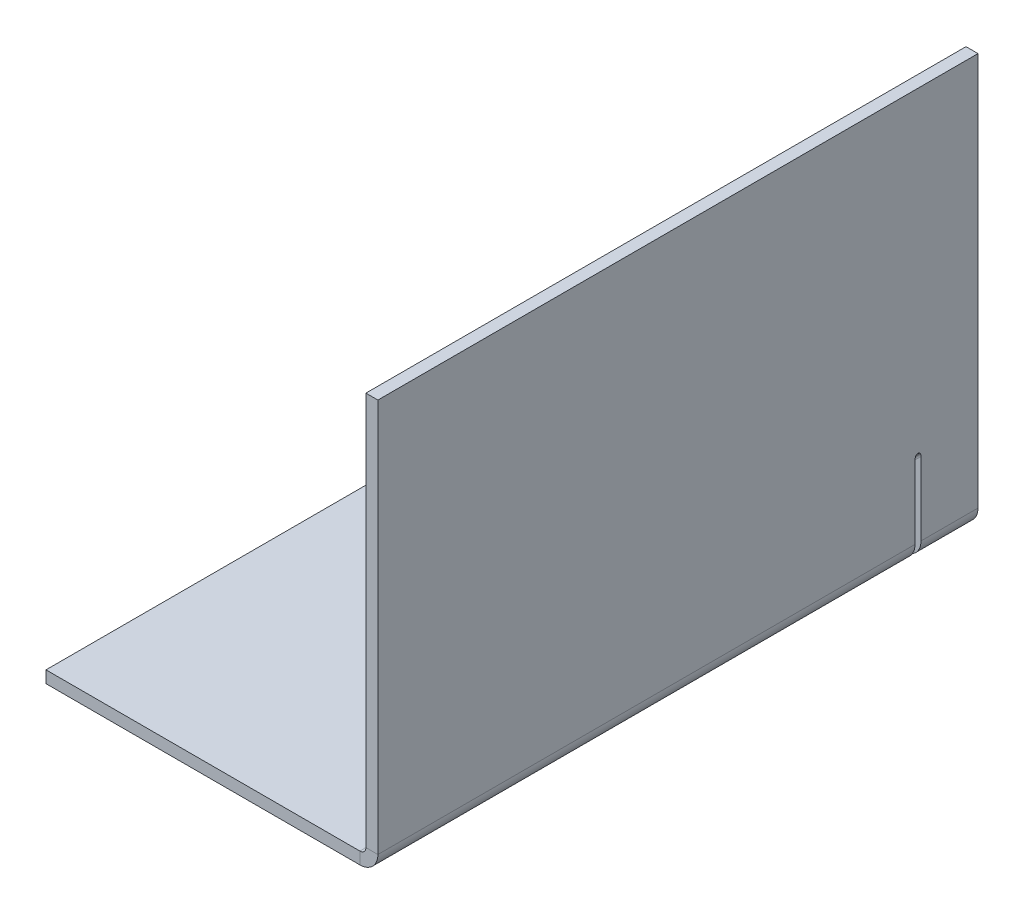
ISO-10303-21;
HEADER;
FILE_DESCRIPTION(('STEP AP214'),'2;1');
FILE_NAME('part.step','',(''),(''),'','','');
FILE_SCHEMA(('AUTOMOTIVE_DESIGN { 1 0 10303 214 1 1 1 1 }'));
ENDSEC;
DATA;
#1=APPLICATION_CONTEXT('core data for automotive mechanical design processes');
#2=APPLICATION_PROTOCOL_DEFINITION('international standard','automotive_design',2000,#1);
#3=PRODUCT_CONTEXT('',#1,'mechanical');
#4=PRODUCT('Part','Part','',(#3));
#5=PRODUCT_RELATED_PRODUCT_CATEGORY('part','',(#4));
#6=PRODUCT_DEFINITION_FORMATION('','',#4);
#7=PRODUCT_DEFINITION_CONTEXT('part definition',#1,'design');
#8=PRODUCT_DEFINITION('design','',#6,#7);
#9=PRODUCT_DEFINITION_SHAPE('','',#8);
#10=(LENGTH_UNIT() NAMED_UNIT(*) SI_UNIT(.MILLI.,.METRE.));
#11=(NAMED_UNIT(*) PLANE_ANGLE_UNIT() SI_UNIT($,.RADIAN.));
#12=(NAMED_UNIT(*) SI_UNIT($,.STERADIAN.) SOLID_ANGLE_UNIT());
#13=UNCERTAINTY_MEASURE_WITH_UNIT(LENGTH_MEASURE(1.E-05),#10,'distance_accuracy_value','');
#14=(GEOMETRIC_REPRESENTATION_CONTEXT(3) GLOBAL_UNCERTAINTY_ASSIGNED_CONTEXT((#13)) GLOBAL_UNIT_ASSIGNED_CONTEXT((#10,
#11,#12)) REPRESENTATION_CONTEXT('',''));
#15=CARTESIAN_POINT('',(0.,0.,0.));
#16=DIRECTION('',(0.,0.,1.));
#17=DIRECTION('',(1.,0.,0.));
#18=AXIS2_PLACEMENT_3D('',#15,#16,#17);
#19=CARTESIAN_POINT('',(-53.3038384150787,-2.,0.));
#20=DIRECTION('',(0.,-1.,0.));
#21=DIRECTION('',(0.,0.,-1.));
#22=AXIS2_PLACEMENT_3D('',#19,#20,#21);
#23=PLANE('',#22);
#24=DIRECTION('',(0.,0.,-1.));
#25=VECTOR('',#24,1.);
#26=CARTESIAN_POINT('',(-1.,-2.,0.));
#27=LINE('',#26,#25);
#28=CARTESIAN_POINT('',(-1.,-2.,9.5));
#29=VERTEX_POINT('',#28);
#30=CARTESIAN_POINT('',(-1.,-2.,0.));
#31=VERTEX_POINT('',#30);
#32=EDGE_CURVE('E246',#29,#31,#27,.T.);
#33=ORIENTED_EDGE('',*,*,#32,.F.);
#34=DIRECTION('',(-1.,0.,0.));
#35=VECTOR('',#34,1.);
#36=CARTESIAN_POINT('',(-53.3038384150787,-2.,9.5));
#37=LINE('',#36,#35);
#38=CARTESIAN_POINT('',(-13.1923881554251,-2.,9.5));
#39=VERTEX_POINT('',#38);
#40=EDGE_CURVE('E181',#29,#39,#37,.T.);
#41=ORIENTED_EDGE('',*,*,#40,.T.);
#42=CARTESIAN_POINT('',(-13.1923881554251,-2.,10.));
#43=DIRECTION('',(0.,-1.,0.));
#44=DIRECTION('',(1.,0.,0.));
#45=AXIS2_PLACEMENT_3D('',#42,#43,#44);
#46=ELLIPSE('',#45,0.707106781186549,0.500000000000001);
#47=CARTESIAN_POINT('',(-13.1923881554251,-2.,10.5));
#48=VERTEX_POINT('',#47);
#49=EDGE_CURVE('E184',#48,#39,#46,.T.);
#50=ORIENTED_EDGE('',*,*,#49,.F.);
#51=DIRECTION('',(-1.,0.,0.));
#52=VECTOR('',#51,1.);
#53=CARTESIAN_POINT('',(-53.3038384150787,-2.,10.5));
#54=LINE('',#53,#52);
#55=CARTESIAN_POINT('',(-1.,-2.,10.5));
#56=VERTEX_POINT('',#55);
#57=EDGE_CURVE('E169',#56,#48,#54,.T.);
#58=ORIENTED_EDGE('',*,*,#57,.F.);
#59=CARTESIAN_POINT('',(-1.,-2.,100.));
#60=VERTEX_POINT('',#59);
#61=EDGE_CURVE('E241',#60,#56,#27,.T.);
#62=ORIENTED_EDGE('',*,*,#61,.F.);
#63=DIRECTION('',(1.,0.,0.));
#64=VECTOR('',#63,1.);
#65=CARTESIAN_POINT('',(-53.3038384150787,-2.,100.));
#66=LINE('',#65,#64);
#67=CARTESIAN_POINT('',(-53.3038384150787,-2.,100.));
#68=VERTEX_POINT('',#67);
#69=EDGE_CURVE('E250',#68,#60,#66,.T.);
#70=ORIENTED_EDGE('',*,*,#69,.F.);
#71=DIRECTION('',(0.,0.,-1.));
#72=VECTOR('',#71,1.);
#73=CARTESIAN_POINT('',(-53.3038384150787,-2.,0.));
#74=LINE('',#73,#72);
#75=CARTESIAN_POINT('',(-53.3038384150787,-2.,0.));
#76=VERTEX_POINT('',#75);
#77=EDGE_CURVE('E255',#76,#68,#74,.F.);
#78=ORIENTED_EDGE('',*,*,#77,.F.);
#79=DIRECTION('',(1.,0.,0.));
#80=VECTOR('',#79,1.);
#81=CARTESIAN_POINT('',(-53.3038384150787,-2.,0.));
#82=LINE('',#81,#80);
#83=EDGE_CURVE('E253',#76,#31,#82,.T.);
#84=ORIENTED_EDGE('',*,*,#83,.T.);
#85=EDGE_LOOP('',(#33,#41,#50,#58,#62,#70,#78,#84));
#86=FACE_BOUND('',#85,.T.);
#87=ADVANCED_FACE('F45',(#86),#23,.T.);
#88=CARTESIAN_POINT('',(2.,0.,0.));
#89=DIRECTION('',(1.,0.,0.));
#90=DIRECTION('',(0.,0.,-1.));
#91=AXIS2_PLACEMENT_3D('',#88,#89,#90);
#92=PLANE('',#91);
#93=CARTESIAN_POINT('',(2.,13.1923881554251,10.));
#94=DIRECTION('',(1.,0.,0.));
#95=DIRECTION('',(0.,1.,0.));
#96=AXIS2_PLACEMENT_3D('',#93,#94,#95);
#97=ELLIPSE('',#96,0.707106781186548,0.500000000000001);
#98=CARTESIAN_POINT('',(2.,13.1923881554251,9.5));
#99=VERTEX_POINT('',#98);
#100=CARTESIAN_POINT('',(2.,13.1923881554251,10.5));
#101=VERTEX_POINT('',#100);
#102=EDGE_CURVE('E12',#99,#101,#97,.T.);
#103=ORIENTED_EDGE('',*,*,#102,.F.);
#104=DIRECTION('',(0.,-1.,0.));
#105=VECTOR('',#104,1.);
#106=CARTESIAN_POINT('',(2.,0.,9.5));
#107=LINE('',#106,#105);
#108=CARTESIAN_POINT('',(2.,1.,9.5));
#109=VERTEX_POINT('',#108);
#110=EDGE_CURVE('E176',#99,#109,#107,.T.);
#111=ORIENTED_EDGE('',*,*,#110,.T.);
#112=DIRECTION('',(0.,0.,-1.));
#113=VECTOR('',#112,1.);
#114=CARTESIAN_POINT('',(2.,1.,0.));
#115=LINE('',#114,#113);
#116=CARTESIAN_POINT('',(2.,1.,0.));
#117=VERTEX_POINT('',#116);
#118=EDGE_CURVE('E247',#117,#109,#115,.F.);
#119=ORIENTED_EDGE('',*,*,#118,.F.);
#120=DIRECTION('',(0.,1.,0.));
#121=VECTOR('',#120,1.);
#122=CARTESIAN_POINT('',(2.,0.,0.));
#123=LINE('',#122,#121);
#124=CARTESIAN_POINT('',(2.,66.585525727806,0.));
#125=VERTEX_POINT('',#124);
#126=EDGE_CURVE('E254',#117,#125,#123,.T.);
#127=ORIENTED_EDGE('',*,*,#126,.T.);
#128=DIRECTION('',(0.,0.,-1.));
#129=VECTOR('',#128,1.);
#130=CARTESIAN_POINT('',(2.,66.585525727806,0.));
#131=LINE('',#130,#129);
#132=CARTESIAN_POINT('',(2.,66.585525727806,100.));
#133=VERTEX_POINT('',#132);
#134=EDGE_CURVE('E266',#125,#133,#131,.F.);
#135=ORIENTED_EDGE('',*,*,#134,.T.);
#136=DIRECTION('',(0.,1.,0.));
#137=VECTOR('',#136,1.);
#138=CARTESIAN_POINT('',(2.,0.,100.));
#139=LINE('',#138,#137);
#140=CARTESIAN_POINT('',(2.,1.,100.));
#141=VERTEX_POINT('',#140);
#142=EDGE_CURVE('E263',#141,#133,#139,.T.);
#143=ORIENTED_EDGE('',*,*,#142,.F.);
#144=CARTESIAN_POINT('',(2.,1.,10.5));
#145=VERTEX_POINT('',#144);
#146=EDGE_CURVE('E174',#145,#141,#115,.F.);
#147=ORIENTED_EDGE('',*,*,#146,.F.);
#148=DIRECTION('',(0.,-1.,0.));
#149=VECTOR('',#148,1.);
#150=CARTESIAN_POINT('',(2.,0.,10.5));
#151=LINE('',#150,#149);
#152=EDGE_CURVE('E60',#101,#145,#151,.T.);
#153=ORIENTED_EDGE('',*,*,#152,.F.);
#154=EDGE_LOOP('',(#103,#111,#119,#127,#135,#143,#147,#153));
#155=FACE_BOUND('',#154,.T.);
#156=ADVANCED_FACE('F172',(#155),#92,.T.);
#157=CARTESIAN_POINT('',(-1.,1.,0.));
#158=DIRECTION('',(0.,0.,-1.));
#159=DIRECTION('',(-1.,0.,0.));
#160=AXIS2_PLACEMENT_3D('',#157,#158,#159);
#161=CYLINDRICAL_SURFACE('',#160,3.);
#162=ORIENTED_EDGE('',*,*,#118,.T.);
#163=CARTESIAN_POINT('',(-1.,1.,9.5));
#164=DIRECTION('',(0.,0.,1.));
#165=DIRECTION('',(1.,0.,0.));
#166=AXIS2_PLACEMENT_3D('',#163,#164,#165);
#167=CIRCLE('',#166,3.);
#168=EDGE_CURVE('E53',#109,#29,#167,.F.);
#169=ORIENTED_EDGE('',*,*,#168,.T.);
#170=ORIENTED_EDGE('',*,*,#32,.T.);
#171=CARTESIAN_POINT('',(-1.,1.,0.));
#172=DIRECTION('',(0.,0.,-1.));
#173=DIRECTION('',(-1.,0.,0.));
#174=AXIS2_PLACEMENT_3D('',#171,#172,#173);
#175=CIRCLE('',#174,3.);
#176=EDGE_CURVE('E260',#117,#31,#175,.T.);
#177=ORIENTED_EDGE('',*,*,#176,.F.);
#178=EDGE_LOOP('',(#162,#169,#170,#177));
#179=FACE_BOUND('',#178,.T.);
#180=ADVANCED_FACE('F294',(#179),#161,.T.);
#181=CARTESIAN_POINT('',(-53.3038384150787,0.,0.));
#182=DIRECTION('',(0.,-1.,0.));
#183=DIRECTION('',(0.,0.,-1.));
#184=AXIS2_PLACEMENT_3D('',#181,#182,#183);
#185=PLANE('',#184);
#186=DIRECTION('',(-1.,0.,0.));
#187=VECTOR('',#186,1.);
#188=CARTESIAN_POINT('',(-53.3038384150787,0.,7.5));
#189=LINE('',#188,#187);
#190=CARTESIAN_POINT('',(-1.,0.,7.5));
#191=VERTEX_POINT('',#190);
#192=CARTESIAN_POINT('',(-11.1923881554251,0.,7.5));
#193=VERTEX_POINT('',#192);
#194=EDGE_CURVE('E201',#191,#193,#189,.T.);
#195=ORIENTED_EDGE('',*,*,#194,.F.);
#196=DIRECTION('',(0.,0.,1.));
#197=VECTOR('',#196,1.);
#198=CARTESIAN_POINT('',(-1.,0.,0.));
#199=LINE('',#198,#197);
#200=CARTESIAN_POINT('',(-1.,0.,0.));
#201=VERTEX_POINT('',#200);
#202=EDGE_CURVE('E233',#191,#201,#199,.F.);
#203=ORIENTED_EDGE('',*,*,#202,.T.);
#204=DIRECTION('',(1.,0.,0.));
#205=VECTOR('',#204,1.);
#206=CARTESIAN_POINT('',(-53.3038384150787,0.,0.));
#207=LINE('',#206,#205);
#208=CARTESIAN_POINT('',(-53.3038384150787,0.,0.));
#209=VERTEX_POINT('',#208);
#210=EDGE_CURVE('E223',#209,#201,#207,.T.);
#211=ORIENTED_EDGE('',*,*,#210,.F.);
#212=DIRECTION('',(0.,0.,1.));
#213=VECTOR('',#212,1.);
#214=CARTESIAN_POINT('',(-53.3038384150787,0.,0.));
#215=LINE('',#214,#213);
#216=CARTESIAN_POINT('',(-53.3038384150787,0.,100.));
#217=VERTEX_POINT('',#216);
#218=EDGE_CURVE('E226',#209,#217,#215,.T.);
#219=ORIENTED_EDGE('',*,*,#218,.T.);
#220=DIRECTION('',(1.,0.,0.));
#221=VECTOR('',#220,1.);
#222=CARTESIAN_POINT('',(-53.3038384150787,0.,100.));
#223=LINE('',#222,#221);
#224=CARTESIAN_POINT('',(-1.,0.,100.));
#225=VERTEX_POINT('',#224);
#226=EDGE_CURVE('E220',#217,#225,#223,.T.);
#227=ORIENTED_EDGE('',*,*,#226,.T.);
#228=CARTESIAN_POINT('',(-1.,0.,12.5));
#229=VERTEX_POINT('',#228);
#230=EDGE_CURVE('E234',#225,#229,#199,.F.);
#231=ORIENTED_EDGE('',*,*,#230,.T.);
#232=DIRECTION('',(-1.,0.,0.));
#233=VECTOR('',#232,1.);
#234=CARTESIAN_POINT('',(-53.3038384150787,0.,12.5));
#235=LINE('',#234,#233);
#236=CARTESIAN_POINT('',(-11.1923881554251,0.,12.5));
#237=VERTEX_POINT('',#236);
#238=EDGE_CURVE('E68',#229,#237,#235,.T.);
#239=ORIENTED_EDGE('',*,*,#238,.T.);
#240=CARTESIAN_POINT('',(-11.1923881554251,0.,10.));
#241=DIRECTION('',(0.,-1.,0.));
#242=DIRECTION('',(1.,0.,0.));
#243=AXIS2_PLACEMENT_3D('',#240,#241,#242);
#244=ELLIPSE('',#243,3.53553390593274,2.5);
#245=EDGE_CURVE('E206',#237,#193,#244,.T.);
#246=ORIENTED_EDGE('',*,*,#245,.T.);
#247=EDGE_LOOP('',(#195,#203,#211,#219,#227,#231,#239,#246));
#248=FACE_BOUND('',#247,.T.);
#249=ADVANCED_FACE('F331',(#248),#185,.F.);
#250=CARTESIAN_POINT('',(0.,0.,0.));
#251=DIRECTION('',(1.,0.,0.));
#252=DIRECTION('',(0.,0.,-1.));
#253=AXIS2_PLACEMENT_3D('',#250,#251,#252);
#254=PLANE('',#253);
#255=DIRECTION('',(0.,-1.,0.));
#256=VECTOR('',#255,1.);
#257=CARTESIAN_POINT('',(0.,0.,7.5));
#258=LINE('',#257,#256);
#259=CARTESIAN_POINT('',(0.,11.1923881554251,7.5));
#260=VERTEX_POINT('',#259);
#261=CARTESIAN_POINT('',(0.,1.,7.5));
#262=VERTEX_POINT('',#261);
#263=EDGE_CURVE('E199',#260,#262,#258,.T.);
#264=ORIENTED_EDGE('',*,*,#263,.F.);
#265=CARTESIAN_POINT('',(0.,11.1923881554251,10.));
#266=DIRECTION('',(1.,0.,0.));
#267=DIRECTION('',(0.,1.,0.));
#268=AXIS2_PLACEMENT_3D('',#265,#266,#267);
#269=ELLIPSE('',#268,3.53553390593274,2.5);
#270=CARTESIAN_POINT('',(0.,11.1923881554251,12.5));
#271=VERTEX_POINT('',#270);
#272=EDGE_CURVE('E203',#260,#271,#269,.T.);
#273=ORIENTED_EDGE('',*,*,#272,.T.);
#274=DIRECTION('',(0.,-1.,0.));
#275=VECTOR('',#274,1.);
#276=CARTESIAN_POINT('',(0.,0.,12.5));
#277=LINE('',#276,#275);
#278=CARTESIAN_POINT('',(0.,1.,12.5));
#279=VERTEX_POINT('',#278);
#280=EDGE_CURVE('E193',#271,#279,#277,.T.);
#281=ORIENTED_EDGE('',*,*,#280,.T.);
#282=DIRECTION('',(0.,0.,1.));
#283=VECTOR('',#282,1.);
#284=CARTESIAN_POINT('',(0.,1.,100.));
#285=LINE('',#284,#283);
#286=CARTESIAN_POINT('',(0.,1.,100.));
#287=VERTEX_POINT('',#286);
#288=EDGE_CURVE('E229',#279,#287,#285,.T.);
#289=ORIENTED_EDGE('',*,*,#288,.T.);
#290=DIRECTION('',(0.,1.,0.));
#291=VECTOR('',#290,1.);
#292=CARTESIAN_POINT('',(0.,0.,100.));
#293=LINE('',#292,#291);
#294=CARTESIAN_POINT('',(0.,66.585525727806,100.));
#295=VERTEX_POINT('',#294);
#296=EDGE_CURVE('E210',#287,#295,#293,.T.);
#297=ORIENTED_EDGE('',*,*,#296,.T.);
#298=DIRECTION('',(0.,0.,1.));
#299=VECTOR('',#298,1.);
#300=CARTESIAN_POINT('',(0.,66.585525727806,0.));
#301=LINE('',#300,#299);
#302=CARTESIAN_POINT('',(0.,66.585525727806,0.));
#303=VERTEX_POINT('',#302);
#304=EDGE_CURVE('E213',#303,#295,#301,.T.);
#305=ORIENTED_EDGE('',*,*,#304,.F.);
#306=DIRECTION('',(0.,1.,0.));
#307=VECTOR('',#306,1.);
#308=CARTESIAN_POINT('',(0.,0.,0.));
#309=LINE('',#308,#307);
#310=CARTESIAN_POINT('',(0.,1.,0.));
#311=VERTEX_POINT('',#310);
#312=EDGE_CURVE('E217',#311,#303,#309,.T.);
#313=ORIENTED_EDGE('',*,*,#312,.F.);
#314=EDGE_CURVE('E230',#311,#262,#285,.T.);
#315=ORIENTED_EDGE('',*,*,#314,.T.);
#316=EDGE_LOOP('',(#264,#273,#281,#289,#297,#305,#313,#315));
#317=FACE_BOUND('',#316,.T.);
#318=ADVANCED_FACE('F321',(#317),#254,.F.);
#319=CARTESIAN_POINT('',(-1.,1.,0.));
#320=DIRECTION('',(0.,0.,-1.));
#321=DIRECTION('',(-1.,0.,0.));
#322=AXIS2_PLACEMENT_3D('',#319,#320,#321);
#323=CYLINDRICAL_SURFACE('',#322,1.);
#324=CARTESIAN_POINT('',(-1.,1.,7.5));
#325=DIRECTION('',(0.,0.,1.));
#326=DIRECTION('',(1.,0.,0.));
#327=AXIS2_PLACEMENT_3D('',#324,#325,#326);
#328=CIRCLE('',#327,1.);
#329=EDGE_CURVE('E197',#262,#191,#328,.F.);
#330=ORIENTED_EDGE('',*,*,#329,.F.);
#331=ORIENTED_EDGE('',*,*,#314,.F.);
#332=CARTESIAN_POINT('',(-1.,1.,0.));
#333=DIRECTION('',(0.,0.,1.));
#334=DIRECTION('',(1.,0.,0.));
#335=AXIS2_PLACEMENT_3D('',#332,#333,#334);
#336=CIRCLE('',#335,1.);
#337=EDGE_CURVE('E214',#311,#201,#336,.F.);
#338=ORIENTED_EDGE('',*,*,#337,.T.);
#339=ORIENTED_EDGE('',*,*,#202,.F.);
#340=EDGE_LOOP('',(#330,#331,#338,#339));
#341=FACE_BOUND('',#340,.T.);
#342=ADVANCED_FACE('F352',(#341),#323,.F.);
#343=CARTESIAN_POINT('',(0.,0.,100.));
#344=DIRECTION('',(0.,0.,-1.));
#345=DIRECTION('',(0.,1.,0.));
#346=AXIS2_PLACEMENT_3D('',#343,#344,#345);
#347=PLANE('',#346);
#348=DIRECTION('',(-1.,0.,0.));
#349=VECTOR('',#348,1.);
#350=CARTESIAN_POINT('',(0.,1.,100.));
#351=LINE('',#350,#349);
#352=EDGE_CURVE('E286',#141,#287,#351,.T.);
#353=ORIENTED_EDGE('',*,*,#352,.F.);
#354=ORIENTED_EDGE('',*,*,#142,.T.);
#355=DIRECTION('',(-1.,0.,0.));
#356=VECTOR('',#355,1.);
#357=CARTESIAN_POINT('',(0.,66.585525727806,100.));
#358=LINE('',#357,#356);
#359=EDGE_CURVE('E284',#133,#295,#358,.T.);
#360=ORIENTED_EDGE('',*,*,#359,.T.);
#361=ORIENTED_EDGE('',*,*,#296,.F.);
#362=EDGE_LOOP('',(#353,#354,#360,#361));
#363=FACE_BOUND('',#362,.T.);
#364=ADVANCED_FACE('F318',(#363),#347,.F.);
#365=CARTESIAN_POINT('',(0.,66.585525727806,0.));
#366=DIRECTION('',(0.,1.,0.));
#367=DIRECTION('',(0.,0.,1.));
#368=AXIS2_PLACEMENT_3D('',#365,#366,#367);
#369=PLANE('',#368);
#370=ORIENTED_EDGE('',*,*,#359,.F.);
#371=ORIENTED_EDGE('',*,*,#134,.F.);
#372=DIRECTION('',(-1.,0.,0.));
#373=VECTOR('',#372,1.);
#374=CARTESIAN_POINT('',(0.,66.585525727806,0.));
#375=LINE('',#374,#373);
#376=EDGE_CURVE('E282',#125,#303,#375,.T.);
#377=ORIENTED_EDGE('',*,*,#376,.T.);
#378=ORIENTED_EDGE('',*,*,#304,.T.);
#379=EDGE_LOOP('',(#370,#371,#377,#378));
#380=FACE_BOUND('',#379,.T.);
#381=ADVANCED_FACE('F313',(#380),#369,.T.);
#382=CARTESIAN_POINT('',(0.,0.,0.));
#383=DIRECTION('',(0.,0.,-1.));
#384=DIRECTION('',(0.,1.,0.));
#385=AXIS2_PLACEMENT_3D('',#382,#383,#384);
#386=PLANE('',#385);
#387=ORIENTED_EDGE('',*,*,#376,.F.);
#388=ORIENTED_EDGE('',*,*,#126,.F.);
#389=DIRECTION('',(-1.,0.,0.));
#390=VECTOR('',#389,1.);
#391=CARTESIAN_POINT('',(0.,1.,0.));
#392=LINE('',#391,#390);
#393=EDGE_CURVE('E280',#117,#311,#392,.T.);
#394=ORIENTED_EDGE('',*,*,#393,.T.);
#395=ORIENTED_EDGE('',*,*,#312,.T.);
#396=EDGE_LOOP('',(#387,#388,#394,#395));
#397=FACE_BOUND('',#396,.T.);
#398=ADVANCED_FACE('F309',(#397),#386,.T.);
#399=CARTESIAN_POINT('',(-1.,1.,0.));
#400=DIRECTION('',(0.,0.,-1.));
#401=DIRECTION('',(-1.,0.,0.));
#402=AXIS2_PLACEMENT_3D('',#399,#400,#401);
#403=PLANE('',#402);
#404=ORIENTED_EDGE('',*,*,#393,.F.);
#405=ORIENTED_EDGE('',*,*,#176,.T.);
#406=DIRECTION('',(0.,1.,0.));
#407=VECTOR('',#406,1.);
#408=CARTESIAN_POINT('',(-1.,0.,0.));
#409=LINE('',#408,#407);
#410=EDGE_CURVE('E277',#31,#201,#409,.T.);
#411=ORIENTED_EDGE('',*,*,#410,.T.);
#412=ORIENTED_EDGE('',*,*,#337,.F.);
#413=EDGE_LOOP('',(#404,#405,#411,#412));
#414=FACE_BOUND('',#413,.T.);
#415=ADVANCED_FACE('F305',(#414),#403,.T.);
#416=CARTESIAN_POINT('',(-53.3038384150787,0.,0.));
#417=DIRECTION('',(0.,0.,-1.));
#418=DIRECTION('',(1.,0.,0.));
#419=AXIS2_PLACEMENT_3D('',#416,#417,#418);
#420=PLANE('',#419);
#421=ORIENTED_EDGE('',*,*,#410,.F.);
#422=ORIENTED_EDGE('',*,*,#83,.F.);
#423=DIRECTION('',(0.,1.,0.));
#424=VECTOR('',#423,1.);
#425=CARTESIAN_POINT('',(-53.3038384150787,0.,0.));
#426=LINE('',#425,#424);
#427=EDGE_CURVE('E275',#76,#209,#426,.T.);
#428=ORIENTED_EDGE('',*,*,#427,.T.);
#429=ORIENTED_EDGE('',*,*,#210,.T.);
#430=EDGE_LOOP('',(#421,#422,#428,#429));
#431=FACE_BOUND('',#430,.T.);
#432=ADVANCED_FACE('F497',(#431),#420,.T.);
#433=CARTESIAN_POINT('',(-53.3038384150787,0.,0.));
#434=DIRECTION('',(1.,0.,0.));
#435=DIRECTION('',(0.,0.,1.));
#436=AXIS2_PLACEMENT_3D('',#433,#434,#435);
#437=PLANE('',#436);
#438=ORIENTED_EDGE('',*,*,#427,.F.);
#439=ORIENTED_EDGE('',*,*,#77,.T.);
#440=DIRECTION('',(0.,1.,0.));
#441=VECTOR('',#440,1.);
#442=CARTESIAN_POINT('',(-53.3038384150787,0.,100.));
#443=LINE('',#442,#441);
#444=EDGE_CURVE('E273',#68,#217,#443,.T.);
#445=ORIENTED_EDGE('',*,*,#444,.T.);
#446=ORIENTED_EDGE('',*,*,#218,.F.);
#447=EDGE_LOOP('',(#438,#439,#445,#446));
#448=FACE_BOUND('',#447,.T.);
#449=ADVANCED_FACE('F486',(#448),#437,.F.);
#450=CARTESIAN_POINT('',(-53.3038384150787,0.,100.));
#451=DIRECTION('',(0.,0.,-1.));
#452=DIRECTION('',(1.,0.,0.));
#453=AXIS2_PLACEMENT_3D('',#450,#451,#452);
#454=PLANE('',#453);
#455=ORIENTED_EDGE('',*,*,#444,.F.);
#456=ORIENTED_EDGE('',*,*,#69,.T.);
#457=DIRECTION('',(0.,1.,0.));
#458=VECTOR('',#457,1.);
#459=CARTESIAN_POINT('',(-1.,0.,100.));
#460=LINE('',#459,#458);
#461=EDGE_CURVE('E237',#60,#225,#460,.T.);
#462=ORIENTED_EDGE('',*,*,#461,.T.);
#463=ORIENTED_EDGE('',*,*,#226,.F.);
#464=EDGE_LOOP('',(#455,#456,#462,#463));
#465=FACE_BOUND('',#464,.T.);
#466=ADVANCED_FACE('F336',(#465),#454,.F.);
#467=CARTESIAN_POINT('',(-1.,1.,100.));
#468=DIRECTION('',(0.,0.,1.));
#469=DIRECTION('',(1.,0.,0.));
#470=AXIS2_PLACEMENT_3D('',#467,#468,#469);
#471=PLANE('',#470);
#472=CARTESIAN_POINT('',(-1.,1.,100.));
#473=DIRECTION('',(0.,0.,-1.));
#474=DIRECTION('',(-1.,0.,0.));
#475=AXIS2_PLACEMENT_3D('',#472,#473,#474);
#476=CIRCLE('',#475,3.);
#477=EDGE_CURVE('E209',#60,#141,#476,.F.);
#478=ORIENTED_EDGE('',*,*,#477,.T.);
#479=ORIENTED_EDGE('',*,*,#352,.T.);
#480=CARTESIAN_POINT('',(-1.,1.,100.));
#481=DIRECTION('',(0.,0.,-1.));
#482=DIRECTION('',(-1.,0.,0.));
#483=AXIS2_PLACEMENT_3D('',#480,#481,#482);
#484=CIRCLE('',#483,1.);
#485=EDGE_CURVE('E238',#225,#287,#484,.F.);
#486=ORIENTED_EDGE('',*,*,#485,.F.);
#487=ORIENTED_EDGE('',*,*,#461,.F.);
#488=EDGE_LOOP('',(#478,#479,#486,#487));
#489=FACE_BOUND('',#488,.T.);
#490=ADVANCED_FACE('F47',(#489),#471,.T.);
#491=ORIENTED_EDGE('',*,*,#288,.F.);
#492=CARTESIAN_POINT('',(-1.,1.,12.5));
#493=DIRECTION('',(0.,0.,1.));
#494=DIRECTION('',(1.,0.,0.));
#495=AXIS2_PLACEMENT_3D('',#492,#493,#494);
#496=CIRCLE('',#495,1.);
#497=EDGE_CURVE('E191',#279,#229,#496,.F.);
#498=ORIENTED_EDGE('',*,*,#497,.T.);
#499=ORIENTED_EDGE('',*,*,#230,.F.);
#500=ORIENTED_EDGE('',*,*,#485,.T.);
#501=EDGE_LOOP('',(#491,#498,#499,#500));
#502=FACE_BOUND('',#501,.T.);
#503=ADVANCED_FACE('F328',(#502),#323,.F.);
#504=CARTESIAN_POINT('',(-1.,1.,10.5));
#505=DIRECTION('',(0.,0.,1.));
#506=DIRECTION('',(1.,0.,0.));
#507=AXIS2_PLACEMENT_3D('',#504,#505,#506);
#508=CIRCLE('',#507,3.);
#509=EDGE_CURVE('E289',#145,#56,#508,.F.);
#510=ORIENTED_EDGE('',*,*,#509,.F.);
#511=ORIENTED_EDGE('',*,*,#146,.T.);
#512=ORIENTED_EDGE('',*,*,#477,.F.);
#513=ORIENTED_EDGE('',*,*,#61,.T.);
#514=EDGE_LOOP('',(#510,#511,#512,#513));
#515=FACE_BOUND('',#514,.T.);
#516=ADVANCED_FACE('F339',(#515),#161,.T.);
#517=CARTESIAN_POINT('',(-15.5923881554251,-4.39999999999998,10.));
#518=DIRECTION('',(0.707106781186548,0.707106781186547,0.));
#519=DIRECTION('',(-0.707106781186547,0.707106781186548,0.));
#520=AXIS2_PLACEMENT_3D('',#517,#518,#519);
#521=CYLINDRICAL_SURFACE('',#520,2.5);
#522=ORIENTED_EDGE('',*,*,#245,.F.);
#523=DIRECTION('',(-0.707106781186548,-0.707106781186547,0.));
#524=VECTOR('',#523,1.);
#525=CARTESIAN_POINT('',(-15.5923881554251,-4.39999999999998,12.5));
#526=LINE('',#525,#524);
#527=EDGE_CURVE('E189',#271,#237,#526,.T.);
#528=ORIENTED_EDGE('',*,*,#527,.F.);
#529=ORIENTED_EDGE('',*,*,#272,.F.);
#530=DIRECTION('',(0.707106781186548,0.707106781186547,0.));
#531=VECTOR('',#530,1.);
#532=CARTESIAN_POINT('',(-5.59619407771256,5.59619407771256,7.5));
#533=LINE('',#532,#531);
#534=EDGE_CURVE('E186',#193,#260,#533,.T.);
#535=ORIENTED_EDGE('',*,*,#534,.F.);
#536=EDGE_LOOP('',(#522,#528,#529,#535));
#537=FACE_BOUND('',#536,.T.);
#538=ADVANCED_FACE('F341',(#537),#521,.T.);
#539=CARTESIAN_POINT('',(0.,0.,7.5));
#540=DIRECTION('',(0.,0.,1.));
#541=DIRECTION('',(1.,0.,0.));
#542=AXIS2_PLACEMENT_3D('',#539,#540,#541);
#543=PLANE('',#542);
#544=ORIENTED_EDGE('',*,*,#329,.T.);
#545=ORIENTED_EDGE('',*,*,#194,.T.);
#546=ORIENTED_EDGE('',*,*,#534,.T.);
#547=ORIENTED_EDGE('',*,*,#263,.T.);
#548=EDGE_LOOP('',(#544,#545,#546,#547));
#549=FACE_BOUND('',#548,.T.);
#550=ADVANCED_FACE('F348',(#549),#543,.F.);
#551=CARTESIAN_POINT('',(0.,0.,12.5));
#552=DIRECTION('',(0.,0.,1.));
#553=DIRECTION('',(1.,0.,0.));
#554=AXIS2_PLACEMENT_3D('',#551,#552,#553);
#555=PLANE('',#554);
#556=ORIENTED_EDGE('',*,*,#238,.F.);
#557=ORIENTED_EDGE('',*,*,#497,.F.);
#558=ORIENTED_EDGE('',*,*,#280,.F.);
#559=ORIENTED_EDGE('',*,*,#527,.T.);
#560=EDGE_LOOP('',(#556,#557,#558,#559));
#561=FACE_BOUND('',#560,.T.);
#562=ADVANCED_FACE('F372',(#561),#555,.T.);
#563=CARTESIAN_POINT('',(-15.5923881554251,-4.39999999999998,10.));
#564=DIRECTION('',(0.707106781186548,0.707106781186547,0.));
#565=DIRECTION('',(-0.707106781186547,0.707106781186548,0.));
#566=AXIS2_PLACEMENT_3D('',#563,#564,#565);
#567=CYLINDRICAL_SURFACE('',#566,0.500000000000001);
#568=ORIENTED_EDGE('',*,*,#49,.T.);
#569=DIRECTION('',(0.707106781186548,0.707106781186547,0.));
#570=VECTOR('',#569,1.);
#571=CARTESIAN_POINT('',(-15.5923881554251,-4.39999999999998,9.5));
#572=LINE('',#571,#570);
#573=EDGE_CURVE('E164',#39,#99,#572,.T.);
#574=ORIENTED_EDGE('',*,*,#573,.T.);
#575=ORIENTED_EDGE('',*,*,#102,.T.);
#576=DIRECTION('',(0.707106781186548,0.707106781186547,0.));
#577=VECTOR('',#576,1.);
#578=CARTESIAN_POINT('',(-15.5923881554251,-4.39999999999998,10.5));
#579=LINE('',#578,#577);
#580=EDGE_CURVE('E161',#101,#48,#579,.F.);
#581=ORIENTED_EDGE('',*,*,#580,.T.);
#582=EDGE_LOOP('',(#568,#574,#575,#581));
#583=FACE_BOUND('',#582,.T.);
#584=ADVANCED_FACE('F160',(#583),#567,.F.);
#585=CARTESIAN_POINT('',(0.,0.,9.5));
#586=DIRECTION('',(0.,0.,1.));
#587=DIRECTION('',(1.,0.,0.));
#588=AXIS2_PLACEMENT_3D('',#585,#586,#587);
#589=PLANE('',#588);
#590=ORIENTED_EDGE('',*,*,#168,.F.);
#591=ORIENTED_EDGE('',*,*,#110,.F.);
#592=ORIENTED_EDGE('',*,*,#573,.F.);
#593=ORIENTED_EDGE('',*,*,#40,.F.);
#594=EDGE_LOOP('',(#590,#591,#592,#593));
#595=FACE_BOUND('',#594,.T.);
#596=ADVANCED_FACE('F378',(#595),#589,.T.);
#597=CARTESIAN_POINT('',(0.,0.,10.5));
#598=DIRECTION('',(0.,0.,1.));
#599=DIRECTION('',(1.,0.,0.));
#600=AXIS2_PLACEMENT_3D('',#597,#598,#599);
#601=PLANE('',#600);
#602=ORIENTED_EDGE('',*,*,#57,.T.);
#603=ORIENTED_EDGE('',*,*,#580,.F.);
#604=ORIENTED_EDGE('',*,*,#152,.T.);
#605=ORIENTED_EDGE('',*,*,#509,.T.);
#606=EDGE_LOOP('',(#602,#603,#604,#605));
#607=FACE_BOUND('',#606,.T.);
#608=ADVANCED_FACE('F167',(#607),#601,.F.);
#609=CLOSED_SHELL('',(#87,#156,#180,#249,#318,#342,#364,#381,#398,#415,#432,#449,#466,#490,#503,
#516,#538,#550,#562,#584,#596,#608));
#610=MANIFOLD_SOLID_BREP('B2',#609);
#611=ADVANCED_BREP_SHAPE_REPRESENTATION('',(#18,#610),#14);
#612=SHAPE_DEFINITION_REPRESENTATION(#9,#611);
ENDSEC;
END-ISO-10303-21;
